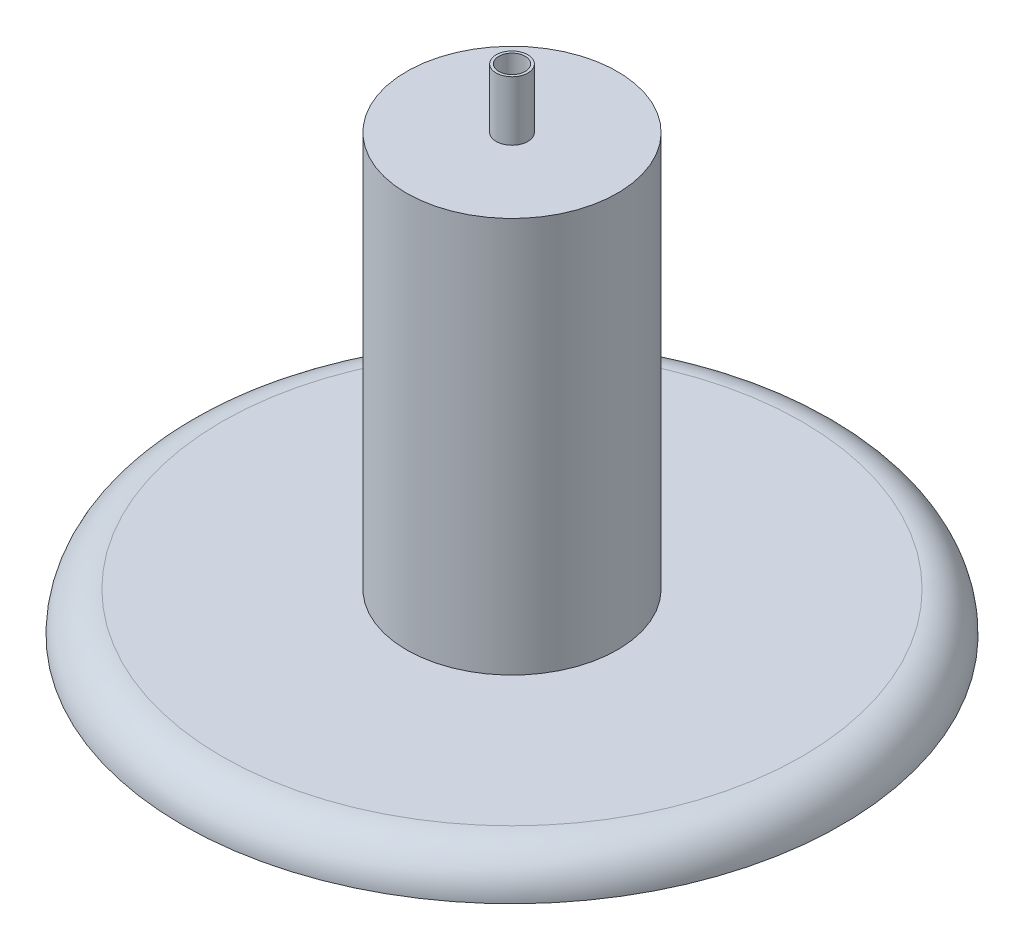
ISO-10303-21;
HEADER;
FILE_DESCRIPTION(('STEP AP214'),'2;1');
FILE_NAME('part.step','',(''),(''),'','','');
FILE_SCHEMA(('AUTOMOTIVE_DESIGN { 1 0 10303 214 1 1 1 1 }'));
ENDSEC;
DATA;
#1=APPLICATION_CONTEXT('core data for automotive mechanical design processes');
#2=APPLICATION_PROTOCOL_DEFINITION('international standard','automotive_design',2000,#1);
#3=PRODUCT_CONTEXT('',#1,'mechanical');
#4=PRODUCT('Part','Part','',(#3));
#5=PRODUCT_RELATED_PRODUCT_CATEGORY('part','',(#4));
#6=PRODUCT_DEFINITION_FORMATION('','',#4);
#7=PRODUCT_DEFINITION_CONTEXT('part definition',#1,'design');
#8=PRODUCT_DEFINITION('design','',#6,#7);
#9=PRODUCT_DEFINITION_SHAPE('','',#8);
#10=(LENGTH_UNIT() NAMED_UNIT(*) SI_UNIT(.MILLI.,.METRE.));
#11=(NAMED_UNIT(*) PLANE_ANGLE_UNIT() SI_UNIT($,.RADIAN.));
#12=(NAMED_UNIT(*) SI_UNIT($,.STERADIAN.) SOLID_ANGLE_UNIT());
#13=UNCERTAINTY_MEASURE_WITH_UNIT(LENGTH_MEASURE(1.E-05),#10,'distance_accuracy_value','');
#14=(GEOMETRIC_REPRESENTATION_CONTEXT(3) GLOBAL_UNCERTAINTY_ASSIGNED_CONTEXT((#13)) GLOBAL_UNIT_ASSIGNED_CONTEXT((#10,
#11,#12)) REPRESENTATION_CONTEXT('',''));
#15=CARTESIAN_POINT('',(0.,0.,0.));
#16=DIRECTION('',(0.,0.,1.));
#17=DIRECTION('',(1.,0.,0.));
#18=AXIS2_PLACEMENT_3D('',#15,#16,#17);
#19=CARTESIAN_POINT('',(0.,30.,0.));
#20=DIRECTION('',(0.,1.,0.));
#21=DIRECTION('',(0.,0.,1.));
#22=AXIS2_PLACEMENT_3D('',#19,#20,#21);
#23=PLANE('',#22);
#24=CARTESIAN_POINT('',(0.,30.,0.));
#25=DIRECTION('',(0.,1.,0.));
#26=DIRECTION('',(0.,0.,1.));
#27=AXIS2_PLACEMENT_3D('',#24,#25,#26);
#28=CIRCLE('',#27,80.);
#29=CARTESIAN_POINT('',(0.,30.,80.));
#30=VERTEX_POINT('',#29);
#31=EDGE_CURVE('E66',#30,#30,#28,.T.);
#32=ORIENTED_EDGE('',*,*,#31,.F.);
#33=EDGE_LOOP('',(#32));
#34=FACE_BOUND('',#33,.T.);
#35=CARTESIAN_POINT('',(0.,30.,0.));
#36=DIRECTION('',(0.,1.,0.));
#37=DIRECTION('',(0.,0.,1.));
#38=AXIS2_PLACEMENT_3D('',#35,#36,#37);
#39=CIRCLE('',#38,220.);
#40=CARTESIAN_POINT('',(0.,30.,220.));
#41=VERTEX_POINT('',#40);
#42=EDGE_CURVE('E47',#41,#41,#39,.T.);
#43=ORIENTED_EDGE('',*,*,#42,.T.);
#44=EDGE_LOOP('',(#43));
#45=FACE_BOUND('',#44,.T.);
#46=ADVANCED_FACE('F43',(#34,#45),#23,.T.);
#47=CARTESIAN_POINT('',(0.,0.,0.));
#48=DIRECTION('',(0.,1.,0.));
#49=DIRECTION('',(0.,0.,1.));
#50=AXIS2_PLACEMENT_3D('',#47,#48,#49);
#51=PLANE('',#50);
#52=CARTESIAN_POINT('',(0.,0.,0.));
#53=DIRECTION('',(0.,1.,0.));
#54=DIRECTION('',(0.,0.,1.));
#55=AXIS2_PLACEMENT_3D('',#52,#53,#54);
#56=CIRCLE('',#55,250.);
#57=CARTESIAN_POINT('',(0.,0.,250.));
#58=VERTEX_POINT('',#57);
#59=EDGE_CURVE('E57',#58,#58,#56,.T.);
#60=ORIENTED_EDGE('',*,*,#59,.F.);
#61=EDGE_LOOP('',(#60));
#62=FACE_BOUND('',#61,.T.);
#63=ADVANCED_FACE('F75',(#62),#51,.F.);
#64=CARTESIAN_POINT('',(0.,0.,0.));
#65=DIRECTION('',(0.,1.,0.));
#66=DIRECTION('',(0.,0.,1.));
#67=AXIS2_PLACEMENT_3D('',#64,#65,#66);
#68=TOROIDAL_SURFACE('',#67,220.,30.);
#69=ORIENTED_EDGE('',*,*,#59,.T.);
#70=EDGE_LOOP('',(#69));
#71=FACE_BOUND('',#70,.T.);
#72=ORIENTED_EDGE('',*,*,#42,.F.);
#73=EDGE_LOOP('',(#72));
#74=FACE_BOUND('',#73,.T.);
#75=ADVANCED_FACE('F45',(#71,#74),#68,.T.);
#76=CARTESIAN_POINT('',(0.,330.,0.));
#77=DIRECTION('',(0.,-1.,0.));
#78=DIRECTION('',(0.,0.,-1.));
#79=AXIS2_PLACEMENT_3D('',#76,#77,#78);
#80=CYLINDRICAL_SURFACE('',#79,80.);
#81=CARTESIAN_POINT('',(0.,330.,0.));
#82=DIRECTION('',(0.,1.,0.));
#83=DIRECTION('',(0.,0.,1.));
#84=AXIS2_PLACEMENT_3D('',#81,#82,#83);
#85=CIRCLE('',#84,80.);
#86=CARTESIAN_POINT('',(0.,330.,80.));
#87=VERTEX_POINT('',#86);
#88=EDGE_CURVE('E62',#87,#87,#85,.T.);
#89=ORIENTED_EDGE('',*,*,#88,.F.);
#90=EDGE_LOOP('',(#89));
#91=FACE_BOUND('',#90,.T.);
#92=ORIENTED_EDGE('',*,*,#31,.T.);
#93=EDGE_LOOP('',(#92));
#94=FACE_BOUND('',#93,.T.);
#95=ADVANCED_FACE('F81',(#91,#94),#80,.T.);
#96=CARTESIAN_POINT('',(0.,330.,0.));
#97=DIRECTION('',(0.,1.,0.));
#98=DIRECTION('',(0.,0.,1.));
#99=AXIS2_PLACEMENT_3D('',#96,#97,#98);
#100=PLANE('',#99);
#101=CARTESIAN_POINT('',(0.,330.,0.));
#102=DIRECTION('',(0.,1.,0.));
#103=DIRECTION('',(0.,0.,1.));
#104=AXIS2_PLACEMENT_3D('',#101,#102,#103);
#105=CIRCLE('',#104,12.);
#106=CARTESIAN_POINT('',(0.,330.,-12.));
#107=VERTEX_POINT('',#106);
#108=EDGE_CURVE('E11',#107,#107,#105,.T.);
#109=ORIENTED_EDGE('',*,*,#108,.F.);
#110=EDGE_LOOP('',(#109));
#111=FACE_BOUND('',#110,.T.);
#112=ORIENTED_EDGE('',*,*,#88,.T.);
#113=EDGE_LOOP('',(#112));
#114=FACE_BOUND('',#113,.T.);
#115=ADVANCED_FACE('F88',(#111,#114),#100,.T.);
#116=CARTESIAN_POINT('',(0.,375.,0.));
#117=DIRECTION('',(0.,-1.,0.));
#118=DIRECTION('',(0.,0.,-1.));
#119=AXIS2_PLACEMENT_3D('',#116,#117,#118);
#120=CYLINDRICAL_SURFACE('',#119,12.);
#121=CARTESIAN_POINT('',(0.,375.,0.));
#122=DIRECTION('',(0.,1.,0.));
#123=DIRECTION('',(0.,0.,1.));
#124=AXIS2_PLACEMENT_3D('',#121,#122,#123);
#125=CIRCLE('',#124,12.);
#126=CARTESIAN_POINT('',(0.,375.,-12.));
#127=VERTEX_POINT('',#126);
#128=EDGE_CURVE('E60',#127,#127,#125,.T.);
#129=CARTESIAN_POINT('',(0.,375.,-12.));
#130=CARTESIAN_POINT('',(0.,374.53125,-12.));
#131=CARTESIAN_POINT('',(0.,374.0625,-12.));
#132=CARTESIAN_POINT('',(0.,373.125,-12.));
#133=CARTESIAN_POINT('',(0.,372.65625,-12.));
#134=CARTESIAN_POINT('',(0.,371.71875,-12.));
#135=CARTESIAN_POINT('',(0.,371.25,-12.));
#136=CARTESIAN_POINT('',(0.,370.3125,-12.));
#137=CARTESIAN_POINT('',(0.,369.84375,-12.));
#138=CARTESIAN_POINT('',(0.,368.90625,-12.));
#139=CARTESIAN_POINT('',(0.,368.4375,-12.));
#140=CARTESIAN_POINT('',(0.,367.5,-12.));
#141=CARTESIAN_POINT('',(0.,367.03125,-12.));
#142=CARTESIAN_POINT('',(0.,366.09375,-12.));
#143=CARTESIAN_POINT('',(0.,365.625,-12.));
#144=CARTESIAN_POINT('',(0.,364.6875,-12.));
#145=CARTESIAN_POINT('',(0.,364.21875,-12.));
#146=CARTESIAN_POINT('',(0.,363.28125,-12.));
#147=CARTESIAN_POINT('',(0.,362.8125,-12.));
#148=CARTESIAN_POINT('',(0.,361.875,-12.));
#149=CARTESIAN_POINT('',(0.,361.40625,-12.));
#150=CARTESIAN_POINT('',(0.,360.46875,-12.));
#151=CARTESIAN_POINT('',(0.,360.,-12.));
#152=CARTESIAN_POINT('',(0.,359.0625,-12.));
#153=CARTESIAN_POINT('',(0.,358.59375,-12.));
#154=CARTESIAN_POINT('',(0.,357.65625,-12.));
#155=CARTESIAN_POINT('',(0.,357.1875,-12.));
#156=CARTESIAN_POINT('',(0.,356.25,-12.));
#157=CARTESIAN_POINT('',(0.,355.78125,-12.));
#158=CARTESIAN_POINT('',(0.,354.84375,-12.));
#159=CARTESIAN_POINT('',(0.,354.375,-12.));
#160=CARTESIAN_POINT('',(0.,353.4375,-12.));
#161=CARTESIAN_POINT('',(0.,352.96875,-12.));
#162=CARTESIAN_POINT('',(0.,352.03125,-12.));
#163=CARTESIAN_POINT('',(0.,351.5625,-12.));
#164=CARTESIAN_POINT('',(0.,350.625,-12.));
#165=CARTESIAN_POINT('',(0.,350.15625,-12.));
#166=CARTESIAN_POINT('',(0.,349.21875,-12.));
#167=CARTESIAN_POINT('',(0.,348.75,-12.));
#168=CARTESIAN_POINT('',(0.,347.8125,-12.));
#169=CARTESIAN_POINT('',(0.,347.34375,-12.));
#170=CARTESIAN_POINT('',(0.,346.40625,-12.));
#171=CARTESIAN_POINT('',(0.,345.9375,-12.));
#172=CARTESIAN_POINT('',(0.,345.,-12.));
#173=CARTESIAN_POINT('',(0.,344.53125,-12.));
#174=CARTESIAN_POINT('',(0.,343.59375,-12.));
#175=CARTESIAN_POINT('',(0.,343.125,-12.));
#176=CARTESIAN_POINT('',(0.,342.1875,-12.));
#177=CARTESIAN_POINT('',(0.,341.71875,-12.));
#178=CARTESIAN_POINT('',(0.,340.78125,-12.));
#179=CARTESIAN_POINT('',(0.,340.3125,-12.));
#180=CARTESIAN_POINT('',(0.,339.375,-12.));
#181=CARTESIAN_POINT('',(0.,338.90625,-12.));
#182=CARTESIAN_POINT('',(0.,337.96875,-12.));
#183=CARTESIAN_POINT('',(0.,337.5,-12.));
#184=CARTESIAN_POINT('',(0.,336.5625,-12.));
#185=CARTESIAN_POINT('',(0.,336.09375,-12.));
#186=CARTESIAN_POINT('',(0.,335.15625,-12.));
#187=CARTESIAN_POINT('',(0.,334.6875,-12.));
#188=CARTESIAN_POINT('',(0.,333.75,-12.));
#189=CARTESIAN_POINT('',(0.,333.28125,-12.));
#190=CARTESIAN_POINT('',(0.,332.34375,-12.));
#191=CARTESIAN_POINT('',(0.,331.875,-12.));
#192=CARTESIAN_POINT('',(0.,330.9375,-12.));
#193=CARTESIAN_POINT('',(0.,330.46875,-12.));
#194=CARTESIAN_POINT('',(0.,330.,-12.));
#195=B_SPLINE_CURVE_WITH_KNOTS('',3,(#129,#130,#131,#132,#133,#134,#135,#136,#137,#138,#139,
#140,#141,#142,#143,#144,#145,#146,#147,#148,#149,#150,#151,#152,#153,#154,#155,#156,#157,#158,
#159,#160,#161,#162,#163,#164,#165,#166,#167,#168,#169,#170,#171,#172,#173,#174,#175,#176,#177,
#178,#179,#180,#181,#182,#183,#184,#185,#186,#187,#188,#189,#190,#191,#192,#193,#194),
.UNSPECIFIED.,.F.,.F.,(4,2,2,2,2,2,2,2,2,2,2,2,2,2,2,2,2,2,2,2,2,2,2,2,2,2,2,2,2,2,2,2,4),(0.,
1.40625000000005,2.81250000000005,4.21875000000005,5.62500000000005,7.03125000000004,
8.43750000000004,9.84375000000004,11.25,12.65625,14.0625,15.46875,16.875,18.28125,19.6875,
21.09375,22.5,23.90625,25.3125,26.71875,28.125,29.53125,30.9375,32.34375,33.75,35.15625,36.5625,
37.96875,39.375,40.78125,42.1875,43.59375,45.),.UNSPECIFIED.);
#196=EDGE_CURVE('BSEAM92',#127,#107,#195,.T.);
#197=ORIENTED_EDGE('',*,*,#128,.F.);
#198=ORIENTED_EDGE('',*,*,#108,.T.);
#199=ORIENTED_EDGE('',*,*,#196,.T.);
#200=ORIENTED_EDGE('',*,*,#196,.F.);
#201=EDGE_LOOP('',(#197,#199,#198,#200));
#202=FACE_BOUND('',#201,.T.);
#203=ADVANCED_FACE('F92',(#202),#120,.T.);
#204=CARTESIAN_POINT('',(0.,375.,0.));
#205=DIRECTION('',(0.,1.,0.));
#206=DIRECTION('',(0.,0.,1.));
#207=AXIS2_PLACEMENT_3D('',#204,#205,#206);
#208=PLANE('',#207);
#209=CARTESIAN_POINT('',(0.,375.,0.));
#210=DIRECTION('',(0.,1.,0.));
#211=DIRECTION('',(0.,0.,1.));
#212=AXIS2_PLACEMENT_3D('',#209,#210,#211);
#213=CIRCLE('',#212,10.);
#214=CARTESIAN_POINT('',(0.,375.,10.));
#215=VERTEX_POINT('',#214);
#216=EDGE_CURVE('E114',#215,#215,#213,.T.);
#217=ORIENTED_EDGE('',*,*,#216,.F.);
#218=EDGE_LOOP('',(#217));
#219=FACE_BOUND('',#218,.T.);
#220=ORIENTED_EDGE('',*,*,#128,.T.);
#221=EDGE_LOOP('',(#220));
#222=FACE_BOUND('',#221,.T.);
#223=ADVANCED_FACE('F96',(#219,#222),#208,.T.);
#224=CARTESIAN_POINT('',(0.,330.,0.));
#225=DIRECTION('',(0.,1.,0.));
#226=DIRECTION('',(0.,0.,1.));
#227=AXIS2_PLACEMENT_3D('',#224,#225,#226);
#228=CYLINDRICAL_SURFACE('',#227,10.);
#229=CARTESIAN_POINT('',(0.,330.,0.));
#230=DIRECTION('',(0.,1.,0.));
#231=DIRECTION('',(0.,0.,1.));
#232=AXIS2_PLACEMENT_3D('',#229,#230,#231);
#233=CIRCLE('',#232,10.);
#234=CARTESIAN_POINT('',(0.,330.,10.));
#235=VERTEX_POINT('',#234);
#236=EDGE_CURVE('E112',#235,#235,#233,.T.);
#237=CARTESIAN_POINT('',(0.,330.,10.));
#238=CARTESIAN_POINT('',(0.,330.46875,10.));
#239=CARTESIAN_POINT('',(0.,330.9375,10.));
#240=CARTESIAN_POINT('',(0.,331.875,10.));
#241=CARTESIAN_POINT('',(0.,332.34375,10.));
#242=CARTESIAN_POINT('',(0.,333.28125,10.));
#243=CARTESIAN_POINT('',(0.,333.75,10.));
#244=CARTESIAN_POINT('',(0.,334.6875,10.));
#245=CARTESIAN_POINT('',(0.,335.15625,10.));
#246=CARTESIAN_POINT('',(0.,336.09375,10.));
#247=CARTESIAN_POINT('',(0.,336.5625,10.));
#248=CARTESIAN_POINT('',(0.,337.5,10.));
#249=CARTESIAN_POINT('',(0.,337.96875,10.));
#250=CARTESIAN_POINT('',(0.,338.90625,10.));
#251=CARTESIAN_POINT('',(0.,339.375,10.));
#252=CARTESIAN_POINT('',(0.,340.3125,10.));
#253=CARTESIAN_POINT('',(0.,340.78125,10.));
#254=CARTESIAN_POINT('',(0.,341.71875,10.));
#255=CARTESIAN_POINT('',(0.,342.1875,10.));
#256=CARTESIAN_POINT('',(0.,343.125,10.));
#257=CARTESIAN_POINT('',(0.,343.59375,10.));
#258=CARTESIAN_POINT('',(0.,344.53125,10.));
#259=CARTESIAN_POINT('',(0.,345.,10.));
#260=CARTESIAN_POINT('',(0.,345.9375,10.));
#261=CARTESIAN_POINT('',(0.,346.40625,10.));
#262=CARTESIAN_POINT('',(0.,347.34375,10.));
#263=CARTESIAN_POINT('',(0.,347.8125,10.));
#264=CARTESIAN_POINT('',(0.,348.75,10.));
#265=CARTESIAN_POINT('',(0.,349.21875,10.));
#266=CARTESIAN_POINT('',(0.,350.15625,10.));
#267=CARTESIAN_POINT('',(0.,350.625,10.));
#268=CARTESIAN_POINT('',(0.,351.5625,10.));
#269=CARTESIAN_POINT('',(0.,352.03125,10.));
#270=CARTESIAN_POINT('',(0.,352.96875,10.));
#271=CARTESIAN_POINT('',(0.,353.4375,10.));
#272=CARTESIAN_POINT('',(0.,354.375,10.));
#273=CARTESIAN_POINT('',(0.,354.84375,10.));
#274=CARTESIAN_POINT('',(0.,355.78125,10.));
#275=CARTESIAN_POINT('',(0.,356.25,10.));
#276=CARTESIAN_POINT('',(0.,357.1875,10.));
#277=CARTESIAN_POINT('',(0.,357.65625,10.));
#278=CARTESIAN_POINT('',(0.,358.59375,10.));
#279=CARTESIAN_POINT('',(0.,359.0625,10.));
#280=CARTESIAN_POINT('',(0.,360.,10.));
#281=CARTESIAN_POINT('',(0.,360.46875,10.));
#282=CARTESIAN_POINT('',(0.,361.40625,10.));
#283=CARTESIAN_POINT('',(0.,361.875,10.));
#284=CARTESIAN_POINT('',(0.,362.8125,10.));
#285=CARTESIAN_POINT('',(0.,363.28125,10.));
#286=CARTESIAN_POINT('',(0.,364.21875,10.));
#287=CARTESIAN_POINT('',(0.,364.6875,10.));
#288=CARTESIAN_POINT('',(0.,365.625,10.));
#289=CARTESIAN_POINT('',(0.,366.09375,10.));
#290=CARTESIAN_POINT('',(0.,367.03125,10.));
#291=CARTESIAN_POINT('',(0.,367.5,10.));
#292=CARTESIAN_POINT('',(0.,368.4375,10.));
#293=CARTESIAN_POINT('',(0.,368.90625,10.));
#294=CARTESIAN_POINT('',(0.,369.84375,10.));
#295=CARTESIAN_POINT('',(0.,370.3125,10.));
#296=CARTESIAN_POINT('',(0.,371.25,10.));
#297=CARTESIAN_POINT('',(0.,371.71875,10.));
#298=CARTESIAN_POINT('',(0.,372.65625,10.));
#299=CARTESIAN_POINT('',(0.,373.125,10.));
#300=CARTESIAN_POINT('',(0.,374.0625,10.));
#301=CARTESIAN_POINT('',(0.,374.53125,10.));
#302=CARTESIAN_POINT('',(0.,375.,10.));
#303=B_SPLINE_CURVE_WITH_KNOTS('',3,(#237,#238,#239,#240,#241,#242,#243,#244,#245,#246,#247,
#248,#249,#250,#251,#252,#253,#254,#255,#256,#257,#258,#259,#260,#261,#262,#263,#264,#265,#266,
#267,#268,#269,#270,#271,#272,#273,#274,#275,#276,#277,#278,#279,#280,#281,#282,#283,#284,#285,
#286,#287,#288,#289,#290,#291,#292,#293,#294,#295,#296,#297,#298,#299,#300,#301,#302),
.UNSPECIFIED.,.F.,.F.,(4,2,2,2,2,2,2,2,2,2,2,2,2,2,2,2,2,2,2,2,2,2,2,2,2,2,2,2,2,2,2,2,4),(0.,
1.40625000000005,2.81250000000005,4.21875000000005,5.62500000000005,7.03125000000004,
8.43750000000004,9.84375000000004,11.25,12.65625,14.0625,15.46875,16.875,18.28125,19.6875,
21.09375,22.5,23.90625,25.3125,26.71875,28.125,29.53125,30.9375,32.34375,33.75,35.15625,36.5625,
37.96875,39.375,40.78125,42.1875,43.59375,45.),.UNSPECIFIED.);
#304=EDGE_CURVE('BSEAM100',#235,#215,#303,.T.);
#305=ORIENTED_EDGE('',*,*,#236,.F.);
#306=ORIENTED_EDGE('',*,*,#216,.T.);
#307=ORIENTED_EDGE('',*,*,#304,.T.);
#308=ORIENTED_EDGE('',*,*,#304,.F.);
#309=EDGE_LOOP('',(#305,#307,#306,#308));
#310=FACE_BOUND('',#309,.T.);
#311=ADVANCED_FACE('F100',(#310),#228,.F.);
#312=CARTESIAN_POINT('',(0.,330.,0.));
#313=DIRECTION('',(0.,1.,0.));
#314=DIRECTION('',(0.,0.,1.));
#315=AXIS2_PLACEMENT_3D('',#312,#313,#314);
#316=PLANE('',#315);
#317=ORIENTED_EDGE('',*,*,#236,.T.);
#318=EDGE_LOOP('',(#317));
#319=FACE_BOUND('',#318,.T.);
#320=ADVANCED_FACE('F104',(#319),#316,.T.);
#321=CLOSED_SHELL('',(#46,#63,#75,#95,#115,#203,#223,#311,#320));
#322=MANIFOLD_SOLID_BREP('B2',#321);
#323=ADVANCED_BREP_SHAPE_REPRESENTATION('',(#18,#322),#14);
#324=SHAPE_DEFINITION_REPRESENTATION(#9,#323);
ENDSEC;
END-ISO-10303-21;
